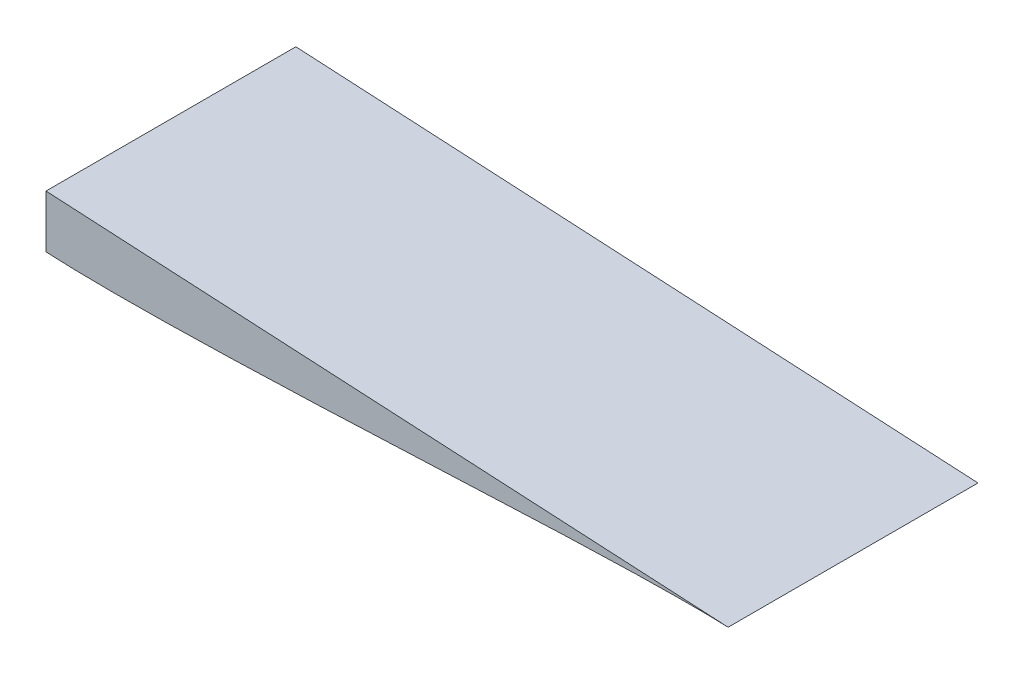
ISO-10303-21;
HEADER;
FILE_DESCRIPTION(('STEP AP214'),'2;1');
FILE_NAME('part.step','',(''),(''),'','','');
FILE_SCHEMA(('AUTOMOTIVE_DESIGN { 1 0 10303 214 1 1 1 1 }'));
ENDSEC;
DATA;
#1=APPLICATION_CONTEXT('core data for automotive mechanical design processes');
#2=APPLICATION_PROTOCOL_DEFINITION('international standard','automotive_design',2000,#1);
#3=PRODUCT_CONTEXT('',#1,'mechanical');
#4=PRODUCT('Part','Part','',(#3));
#5=PRODUCT_RELATED_PRODUCT_CATEGORY('part','',(#4));
#6=PRODUCT_DEFINITION_FORMATION('','',#4);
#7=PRODUCT_DEFINITION_CONTEXT('part definition',#1,'design');
#8=PRODUCT_DEFINITION('design','',#6,#7);
#9=PRODUCT_DEFINITION_SHAPE('','',#8);
#10=(LENGTH_UNIT() NAMED_UNIT(*) SI_UNIT(.MILLI.,.METRE.));
#11=(NAMED_UNIT(*) PLANE_ANGLE_UNIT() SI_UNIT($,.RADIAN.));
#12=(NAMED_UNIT(*) SI_UNIT($,.STERADIAN.) SOLID_ANGLE_UNIT());
#13=UNCERTAINTY_MEASURE_WITH_UNIT(LENGTH_MEASURE(1.E-05),#10,'distance_accuracy_value','');
#14=(GEOMETRIC_REPRESENTATION_CONTEXT(3) GLOBAL_UNCERTAINTY_ASSIGNED_CONTEXT((#13)) GLOBAL_UNIT_ASSIGNED_CONTEXT((#10,
#11,#12)) REPRESENTATION_CONTEXT('',''));
#15=CARTESIAN_POINT('',(0.,0.,0.));
#16=DIRECTION('',(0.,0.,1.));
#17=DIRECTION('',(1.,0.,0.));
#18=AXIS2_PLACEMENT_3D('',#15,#16,#17);
#19=CARTESIAN_POINT('',(304.8,0.,101.6));
#20=CARTESIAN_POINT('',(304.801618834867,0.0105404782342497,101.6));
#21=CARTESIAN_POINT('',(302.668974732205,0.220720306657686,101.6));
#22=CARTESIAN_POINT('',(300.521978172348,0.544561192924455,101.6));
#23=CARTESIAN_POINT('',(295.368886494755,1.2875328814366,101.6));
#24=CARTESIAN_POINT('',(289.160913878016,2.33645198943612,101.6));
#25=CARTESIAN_POINT('',(281.213840868588,3.71952821524651,101.6));
#26=CARTESIAN_POINT('',(272.021147758702,5.34248875191025,101.6));
#27=CARTESIAN_POINT('',(261.61106980903,7.12581444026362,101.6));
#28=CARTESIAN_POINT('',(250.148168886435,8.97226886192319,101.6));
#29=CARTESIAN_POINT('',(237.729227104966,10.7955186206566,101.6));
#30=CARTESIAN_POINT('',(224.4666688294,12.5459449601576,101.6));
#31=CARTESIAN_POINT('',(210.486966245019,14.2121187859213,101.6));
#32=CARTESIAN_POINT('',(195.939334379785,15.7786391055407,101.6));
#33=CARTESIAN_POINT('',(180.985449003124,17.2134697935107,101.6));
#34=CARTESIAN_POINT('',(165.790506747141,18.4813404806245,101.6));
#35=CARTESIAN_POINT('',(150.517335733816,19.5549981658971,101.6));
#36=CARTESIAN_POINT('',(135.325856865066,20.3976314342068,101.6));
#37=CARTESIAN_POINT('',(120.373654992444,20.983402039553,101.6));
#38=CARTESIAN_POINT('',(105.811891909707,21.2901601969632,101.6));
#39=CARTESIAN_POINT('',(91.7834874256825,21.2891036129287,101.6));
#40=CARTESIAN_POINT('',(78.4213620958899,20.9724951941915,101.6));
#41=CARTESIAN_POINT('',(65.8465275942558,20.3288254222291,101.6));
#42=CARTESIAN_POINT('',(54.1674017080585,19.3418794529403,101.6));
#43=CARTESIAN_POINT('',(43.474395079397,18.0330161813823,101.6));
#44=CARTESIAN_POINT('',(33.848689518524,16.4081639477774,101.6));
#45=CARTESIAN_POINT('',(25.3525506097424,14.4995409589336,101.6));
#46=CARTESIAN_POINT('',(18.0396313851052,12.3489155419126,101.6));
#47=CARTESIAN_POINT('',(11.9313896383541,10.0040370443031,101.6));
#48=CARTESIAN_POINT('',(7.08806507391777,7.53974305233434,101.6));
#49=CARTESIAN_POINT('',(3.40966941680189,5.06299945206396,101.6));
#50=CARTESIAN_POINT('',(1.15047901155272,2.68947505766282,101.6));
#51=CARTESIAN_POINT('',(-0.341456030932099,0.406213919537651,101.6));
#52=CARTESIAN_POINT('',(0.675206570607262,-2.00354445611635,101.6));
#53=CARTESIAN_POINT('',(3.58588645216127,-3.09345358903431,101.6));
#54=CARTESIAN_POINT('',(7.58846446919399,-4.35432891948392,101.6));
#55=CARTESIAN_POINT('',(13.2868004017993,-5.2878446315287,101.6));
#56=CARTESIAN_POINT('',(20.4322213072078,-6.08390726300857,101.6));
#57=CARTESIAN_POINT('',(29.0601683745068,-6.63974445543199,101.6));
#58=CARTESIAN_POINT('',(39.0679392576195,-6.99535450967022,101.6));
#59=CARTESIAN_POINT('',(50.3738441198648,-7.15527669006167,101.6));
#60=CARTESIAN_POINT('',(62.8572545491746,-7.14769616357257,101.6));
#61=CARTESIAN_POINT('',(76.3838964062546,-6.99316288317003,101.6));
#62=CARTESIAN_POINT('',(90.803190635399,-6.69861797165631,101.6));
#63=CARTESIAN_POINT('',(105.956834514056,-6.28368257572137,101.6));
#64=CARTESIAN_POINT('',(121.677348300616,-5.77052452309991,101.6));
#65=CARTESIAN_POINT('',(137.789976771838,-5.17586180163704,101.6));
#66=CARTESIAN_POINT('',(154.114864341391,-4.5177658027107,101.6));
#67=CARTESIAN_POINT('',(170.470018260583,-3.81546046006647,101.6));
#68=CARTESIAN_POINT('',(186.670857634618,-3.10033802920193,101.6));
#69=CARTESIAN_POINT('',(202.53208503216,-2.39092903583911,101.6));
#70=CARTESIAN_POINT('',(217.868391943782,-1.72482697070617,101.6));
#71=CARTESIAN_POINT('',(232.49282342498,-1.11499096294753,101.6));
#72=CARTESIAN_POINT('',(246.220887098932,-0.613930048939535,101.6));
#73=CARTESIAN_POINT('',(258.861467046827,-0.21565642278579,101.6));
#74=CARTESIAN_POINT('',(270.253080456814,0.0553538764319012,101.6));
#75=CARTESIAN_POINT('',(280.188997103178,0.219595784232055,101.6));
#76=CARTESIAN_POINT('',(288.650498905082,0.274785104169071,101.6));
#77=CARTESIAN_POINT('',(295.155593423962,0.261686700063953,101.6));
#78=CARTESIAN_POINT('',(300.464576396964,0.143666173546565,101.6));
#79=CARTESIAN_POINT('',(302.659622580391,0.115723261363336,101.6));
#80=CARTESIAN_POINT('',(304.798389635185,-0.010485328450841,101.6));
#81=CARTESIAN_POINT('',(304.8,0.,101.6));
#82=B_SPLINE_CURVE_WITH_KNOTS('',3,(#19,#20,#21,#22,#23,#24,#25,#26,#27,#28,#29,#30,#31,#32,#33,
#34,#35,#36,#37,#38,#39,#40,#41,#42,#43,#44,#45,#46,#47,#48,#49,#50,#51,#52,#53,#54,#55,#56,#57,
#58,#59,#60,#61,#62,#63,#64,#65,#66,#67,#68,#69,#70,#71,#72,#73,#74,#75,#76,#77,#78,#79,#80,
#81),.UNSPECIFIED.,.T.,.F.,(4,1,1,1,1,1,1,1,1,1,1,1,1,1,1,1,1,1,1,1,1,1,1,1,1,1,1,1,1,1,1,1,1,1,
1,1,1,1,1,1,1,1,1,1,1,1,1,1,1,1,1,1,1,1,1,1,1,1,1,1,4),(0.,0.00163269975936438,
0.00645583458730916,0.0142733719650962,0.0248437929891213,0.0378823655436665,0.0531077412083435,
0.0702622662658386,0.0891122502270111,0.109473671361897,0.13118279114636,0.154044071471589,
0.177807645474636,0.202201781747178,0.22695975540666,0.25181615217405,0.276516239060432,
0.300807474077759,0.324444283219669,0.347208207468047,0.368893732879896,0.38931364936161,
0.408315169114752,0.425773142382184,0.441588353173764,0.455679939739565,0.468012176237163,
0.47856661795016,0.487362799824908,0.494418821257916,0.499795181040829,0.503597783370769,
0.506520218572362,0.511061336465782,0.517923774571212,0.527204743484056,0.538873845676215,
0.552882495022793,0.569133331358659,0.587485764973588,0.607759264884705,0.629725606442591,
0.653145173637746,0.67776248750032,0.703306431792791,0.729490768205414,0.756024037319581,
0.782609438114174,0.80894956263962,0.834737242055006,0.859674704050141,0.883459774321026,
0.905784827252887,0.92634926584387,0.944857552516611,0.961054710792989,0.97470052921618,
0.985589471560421,0.993530514736504,0.998375842835772,1.),.UNSPECIFIED.);
#83=DIRECTION('',(0.,0.,-1.));
#84=VECTOR('',#83,1.);
#85=SURFACE_OF_LINEAR_EXTRUSION('',#82,#84);
#86=DIRECTION('',(0.,0.,1.));
#87=VECTOR('',#86,1.);
#88=CARTESIAN_POINT('',(304.799999998828,-7.62818644435745E-09,-0.001000000000001));
#89=LINE('',#88,#87);
#90=CARTESIAN_POINT('',(304.799999998828,-7.62818644435745E-09,0.));
#91=VERTEX_POINT('',#90);
#92=CARTESIAN_POINT('',(304.799999998828,-7.62818644435745E-09,101.6));
#93=VERTEX_POINT('',#92);
#94=EDGE_CURVE('E143',#91,#93,#89,.T.);
#95=ORIENTED_EDGE('',*,*,#94,.T.);
#96=CARTESIAN_POINT('',(27.4320000117852,-6.50970591696267,101.6));
#97=VERTEX_POINT('',#96);
#98=EDGE_CURVE('E12',#97,#93,#82,.T.);
#99=ORIENTED_EDGE('',*,*,#98,.F.);
#100=DIRECTION('',(0.,0.,1.));
#101=VECTOR('',#100,1.);
#102=CARTESIAN_POINT('',(27.4320000117852,-6.50970591696267,-0.001000000000001));
#103=LINE('',#102,#101);
#104=CARTESIAN_POINT('',(27.4320000117852,-6.50970591696267,0.));
#105=VERTEX_POINT('',#104);
#106=EDGE_CURVE('E135',#105,#97,#103,.T.);
#107=ORIENTED_EDGE('',*,*,#106,.F.);
#108=CARTESIAN_POINT('',(304.8,0.,0.));
#109=CARTESIAN_POINT('',(304.801618834867,0.0105404782342497,0.));
#110=CARTESIAN_POINT('',(302.668974732205,0.220720306657686,0.));
#111=CARTESIAN_POINT('',(300.521978172348,0.544561192924455,0.));
#112=CARTESIAN_POINT('',(295.368886494755,1.2875328814366,0.));
#113=CARTESIAN_POINT('',(289.160913878016,2.33645198943612,0.));
#114=CARTESIAN_POINT('',(281.213840868588,3.71952821524651,0.));
#115=CARTESIAN_POINT('',(272.021147758702,5.34248875191025,0.));
#116=CARTESIAN_POINT('',(261.61106980903,7.12581444026362,0.));
#117=CARTESIAN_POINT('',(250.148168886435,8.97226886192319,0.));
#118=CARTESIAN_POINT('',(237.729227104966,10.7955186206566,0.));
#119=CARTESIAN_POINT('',(224.4666688294,12.5459449601576,0.));
#120=CARTESIAN_POINT('',(210.486966245019,14.2121187859213,0.));
#121=CARTESIAN_POINT('',(195.939334379785,15.7786391055407,0.));
#122=CARTESIAN_POINT('',(180.985449003124,17.2134697935107,0.));
#123=CARTESIAN_POINT('',(165.790506747141,18.4813404806245,0.));
#124=CARTESIAN_POINT('',(150.517335733816,19.5549981658971,0.));
#125=CARTESIAN_POINT('',(135.325856865066,20.3976314342068,0.));
#126=CARTESIAN_POINT('',(120.373654992444,20.983402039553,0.));
#127=CARTESIAN_POINT('',(105.811891909707,21.2901601969632,0.));
#128=CARTESIAN_POINT('',(91.7834874256825,21.2891036129287,0.));
#129=CARTESIAN_POINT('',(78.4213620958899,20.9724951941915,0.));
#130=CARTESIAN_POINT('',(65.8465275942558,20.3288254222291,0.));
#131=CARTESIAN_POINT('',(54.1674017080585,19.3418794529403,0.));
#132=CARTESIAN_POINT('',(43.474395079397,18.0330161813823,0.));
#133=CARTESIAN_POINT('',(33.848689518524,16.4081639477774,0.));
#134=CARTESIAN_POINT('',(25.3525506097424,14.4995409589336,0.));
#135=CARTESIAN_POINT('',(18.0396313851052,12.3489155419126,0.));
#136=CARTESIAN_POINT('',(11.9313896383541,10.0040370443031,0.));
#137=CARTESIAN_POINT('',(7.08806507391777,7.53974305233434,0.));
#138=CARTESIAN_POINT('',(3.40966941680189,5.06299945206396,0.));
#139=CARTESIAN_POINT('',(1.15047901155272,2.68947505766282,0.));
#140=CARTESIAN_POINT('',(-0.341456030932099,0.406213919537651,0.));
#141=CARTESIAN_POINT('',(0.675206570607262,-2.00354445611635,0.));
#142=CARTESIAN_POINT('',(3.58588645216127,-3.09345358903431,0.));
#143=CARTESIAN_POINT('',(7.58846446919399,-4.35432891948392,0.));
#144=CARTESIAN_POINT('',(13.2868004017993,-5.2878446315287,0.));
#145=CARTESIAN_POINT('',(20.4322213072078,-6.08390726300857,0.));
#146=CARTESIAN_POINT('',(29.0601683745068,-6.63974445543199,0.));
#147=CARTESIAN_POINT('',(39.0679392576195,-6.99535450967022,0.));
#148=CARTESIAN_POINT('',(50.3738441198648,-7.15527669006167,0.));
#149=CARTESIAN_POINT('',(62.8572545491746,-7.14769616357257,0.));
#150=CARTESIAN_POINT('',(76.3838964062546,-6.99316288317003,0.));
#151=CARTESIAN_POINT('',(90.803190635399,-6.69861797165631,0.));
#152=CARTESIAN_POINT('',(105.956834514056,-6.28368257572137,0.));
#153=CARTESIAN_POINT('',(121.677348300616,-5.77052452309991,0.));
#154=CARTESIAN_POINT('',(137.789976771838,-5.17586180163704,0.));
#155=CARTESIAN_POINT('',(154.114864341391,-4.5177658027107,0.));
#156=CARTESIAN_POINT('',(170.470018260583,-3.81546046006647,0.));
#157=CARTESIAN_POINT('',(186.670857634618,-3.10033802920193,0.));
#158=CARTESIAN_POINT('',(202.53208503216,-2.39092903583911,0.));
#159=CARTESIAN_POINT('',(217.868391943782,-1.72482697070617,0.));
#160=CARTESIAN_POINT('',(232.49282342498,-1.11499096294753,0.));
#161=CARTESIAN_POINT('',(246.220887098932,-0.613930048939535,0.));
#162=CARTESIAN_POINT('',(258.861467046827,-0.21565642278579,0.));
#163=CARTESIAN_POINT('',(270.253080456814,0.0553538764319012,0.));
#164=CARTESIAN_POINT('',(280.188997103178,0.219595784232055,0.));
#165=CARTESIAN_POINT('',(288.650498905082,0.274785104169071,0.));
#166=CARTESIAN_POINT('',(295.155593423962,0.261686700063953,0.));
#167=CARTESIAN_POINT('',(300.464576396964,0.143666173546565,0.));
#168=CARTESIAN_POINT('',(302.659622580391,0.115723261363336,0.));
#169=CARTESIAN_POINT('',(304.798389635185,-0.010485328450841,0.));
#170=CARTESIAN_POINT('',(304.8,0.,0.));
#171=B_SPLINE_CURVE_WITH_KNOTS('',3,(#108,#109,#110,#111,#112,#113,#114,#115,#116,#117,#118,
#119,#120,#121,#122,#123,#124,#125,#126,#127,#128,#129,#130,#131,#132,#133,#134,#135,#136,#137,
#138,#139,#140,#141,#142,#143,#144,#145,#146,#147,#148,#149,#150,#151,#152,#153,#154,#155,#156,
#157,#158,#159,#160,#161,#162,#163,#164,#165,#166,#167,#168,#169,#170),.UNSPECIFIED.,.T.,.F.,(4,
1,1,1,1,1,1,1,1,1,1,1,1,1,1,1,1,1,1,1,1,1,1,1,1,1,1,1,1,1,1,1,1,1,1,1,1,1,1,1,1,1,1,1,1,1,1,1,1,
1,1,1,1,1,1,1,1,1,1,1,4),(0.,0.00163269975936438,0.00645583458730916,0.0142733719650962,
0.0248437929891213,0.0378823655436665,0.0531077412083435,0.0702622662658386,0.0891122502270111,
0.109473671361897,0.13118279114636,0.154044071471589,0.177807645474636,0.202201781747178,
0.22695975540666,0.25181615217405,0.276516239060432,0.300807474077759,0.324444283219669,
0.347208207468047,0.368893732879896,0.38931364936161,0.408315169114752,0.425773142382184,
0.441588353173764,0.455679939739565,0.468012176237163,0.47856661795016,0.487362799824908,
0.494418821257916,0.499795181040829,0.503597783370769,0.506520218572362,0.511061336465782,
0.517923774571212,0.527204743484056,0.538873845676215,0.552882495022793,0.569133331358659,
0.587485764973588,0.607759264884705,0.629725606442591,0.653145173637746,0.67776248750032,
0.703306431792791,0.729490768205414,0.756024037319581,0.782609438114174,0.80894956263962,
0.834737242055006,0.859674704050141,0.883459774321026,0.905784827252887,0.92634926584387,
0.944857552516611,0.961054710792989,0.97470052921618,0.985589471560421,0.993530514736504,
0.998375842835772,1.),.UNSPECIFIED.);
#172=EDGE_CURVE('E97',#105,#91,#171,.T.);
#173=ORIENTED_EDGE('',*,*,#172,.T.);
#174=EDGE_LOOP('',(#95,#99,#107,#173));
#175=FACE_BOUND('',#174,.T.);
#176=ADVANCED_FACE('F93',(#175),#85,.F.);
#177=CARTESIAN_POINT('',(0.901947745585612,2.21992263356822,101.6));
#178=DIRECTION('',(0.,0.,-1.));
#179=DIRECTION('',(-1.,0.,0.));
#180=AXIS2_PLACEMENT_3D('',#177,#178,#179);
#181=PLANE('',#180);
#182=ORIENTED_EDGE('',*,*,#98,.T.);
#183=DIRECTION('',(0.998554982974115,-0.0537396127411212,0.));
#184=VECTOR('',#183,1.);
#185=CARTESIAN_POINT('',(0.880245933962017,16.3561648245353,101.6));
#186=LINE('',#185,#184);
#187=CARTESIAN_POINT('',(27.4320000000002,14.9272189923724,101.6));
#188=VERTEX_POINT('',#187);
#189=EDGE_CURVE('E131',#188,#93,#186,.T.);
#190=ORIENTED_EDGE('',*,*,#189,.F.);
#191=DIRECTION('',(0.,-1.,0.));
#192=VECTOR('',#191,1.);
#193=CARTESIAN_POINT('',(27.432,0.,101.6));
#194=LINE('',#193,#192);
#195=EDGE_CURVE('E136',#188,#97,#194,.T.);
#196=ORIENTED_EDGE('',*,*,#195,.T.);
#197=EDGE_LOOP('',(#182,#190,#196));
#198=FACE_BOUND('',#197,.T.);
#199=ADVANCED_FACE('F140',(#198),#181,.F.);
#200=CARTESIAN_POINT('',(0.901947745585612,2.21992263356822,0.));
#201=DIRECTION('',(0.,0.,-1.));
#202=DIRECTION('',(-1.,0.,0.));
#203=AXIS2_PLACEMENT_3D('',#200,#201,#202);
#204=PLANE('',#203);
#205=DIRECTION('',(0.998554982974115,-0.0537396127411212,0.));
#206=VECTOR('',#205,1.);
#207=CARTESIAN_POINT('',(0.880245933962017,16.3561648245353,0.));
#208=LINE('',#207,#206);
#209=CARTESIAN_POINT('',(27.4320000000002,14.9272189923724,0.));
#210=VERTEX_POINT('',#209);
#211=EDGE_CURVE('E110',#210,#91,#208,.T.);
#212=ORIENTED_EDGE('',*,*,#211,.T.);
#213=ORIENTED_EDGE('',*,*,#172,.F.);
#214=DIRECTION('',(0.,-1.,0.));
#215=VECTOR('',#214,1.);
#216=CARTESIAN_POINT('',(27.432,0.,0.));
#217=LINE('',#216,#215);
#218=EDGE_CURVE('E117',#210,#105,#217,.T.);
#219=ORIENTED_EDGE('',*,*,#218,.F.);
#220=EDGE_LOOP('',(#212,#213,#219));
#221=FACE_BOUND('',#220,.T.);
#222=ADVANCED_FACE('F169',(#221),#204,.T.);
#223=CARTESIAN_POINT('',(27.432,0.,-0.001000000000001));
#224=DIRECTION('',(-1.,0.,0.));
#225=DIRECTION('',(0.,-1.,0.));
#226=AXIS2_PLACEMENT_3D('',#223,#224,#225);
#227=PLANE('',#226);
#228=ORIENTED_EDGE('',*,*,#218,.T.);
#229=ORIENTED_EDGE('',*,*,#106,.T.);
#230=ORIENTED_EDGE('',*,*,#195,.F.);
#231=DIRECTION('',(0.,0.,1.));
#232=VECTOR('',#231,1.);
#233=CARTESIAN_POINT('',(27.4320000000002,14.9272189923724,-0.001000000000001));
#234=LINE('',#233,#232);
#235=EDGE_CURVE('E128',#210,#188,#234,.T.);
#236=ORIENTED_EDGE('',*,*,#235,.F.);
#237=EDGE_LOOP('',(#228,#229,#230,#236));
#238=FACE_BOUND('',#237,.T.);
#239=ADVANCED_FACE('F145',(#238),#227,.T.);
#240=CARTESIAN_POINT('',(0.880245933962017,16.3561648245353,-0.001000000000001));
#241=DIRECTION('',(-0.0537396127411212,-0.998554982974115,0.));
#242=DIRECTION('',(0.998554982974115,-0.0537396127411212,0.));
#243=AXIS2_PLACEMENT_3D('',#240,#241,#242);
#244=PLANE('',#243);
#245=ORIENTED_EDGE('',*,*,#235,.T.);
#246=ORIENTED_EDGE('',*,*,#189,.T.);
#247=ORIENTED_EDGE('',*,*,#94,.F.);
#248=ORIENTED_EDGE('',*,*,#211,.F.);
#249=EDGE_LOOP('',(#245,#246,#247,#248));
#250=FACE_BOUND('',#249,.T.);
#251=ADVANCED_FACE('F130',(#250),#244,.F.);
#252=CLOSED_SHELL('',(#176,#199,#222,#239,#251));
#253=MANIFOLD_SOLID_BREP('B2',#252);
#254=ADVANCED_BREP_SHAPE_REPRESENTATION('',(#18,#253),#14);
#255=SHAPE_DEFINITION_REPRESENTATION(#9,#254);
ENDSEC;
END-ISO-10303-21;
